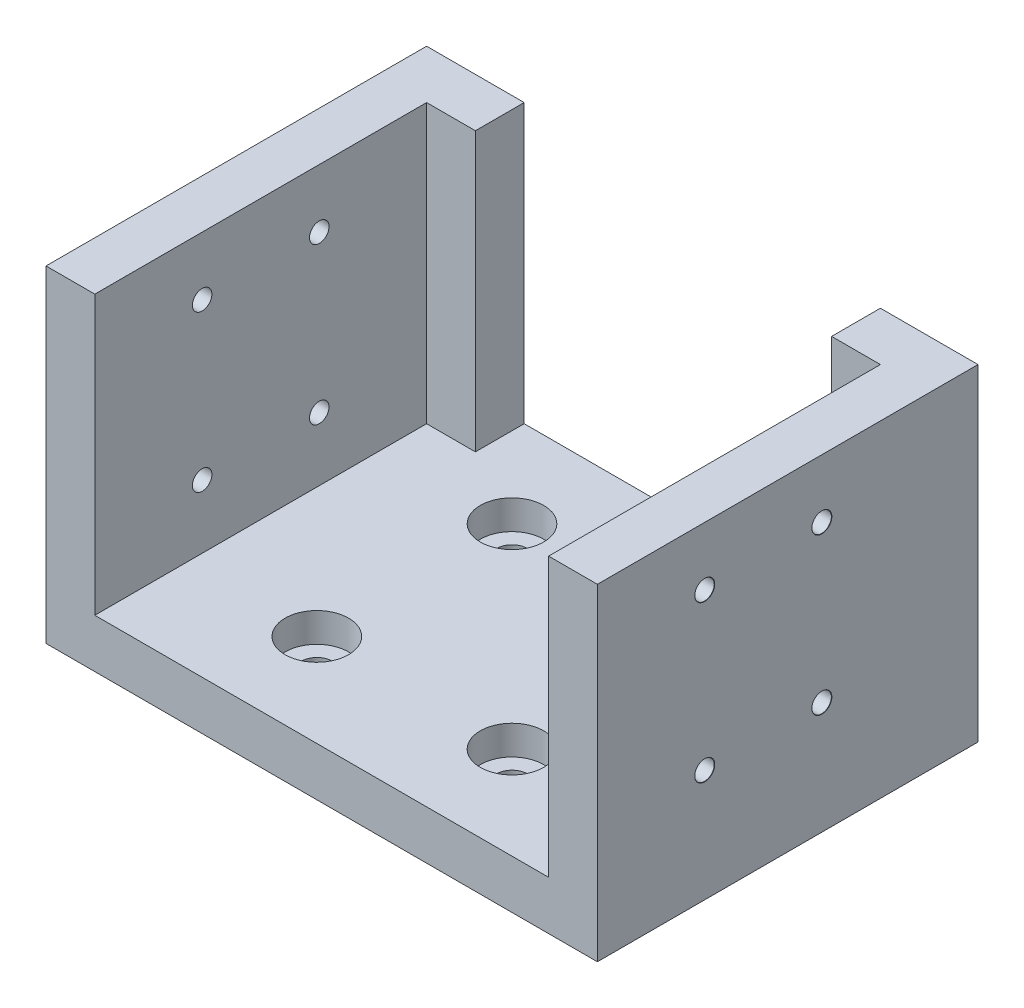
ISO-10303-21;
HEADER;
FILE_DESCRIPTION(('STEP AP214'),'2;1');
FILE_NAME('part.step','',(''),(''),'','','');
FILE_SCHEMA(('AUTOMOTIVE_DESIGN { 1 0 10303 214 1 1 1 1 }'));
ENDSEC;
DATA;
#1=APPLICATION_CONTEXT('core data for automotive mechanical design processes');
#2=APPLICATION_PROTOCOL_DEFINITION('international standard','automotive_design',2000,#1);
#3=PRODUCT_CONTEXT('',#1,'mechanical');
#4=PRODUCT('Part','Part','',(#3));
#5=PRODUCT_RELATED_PRODUCT_CATEGORY('part','',(#4));
#6=PRODUCT_DEFINITION_FORMATION('','',#4);
#7=PRODUCT_DEFINITION_CONTEXT('part definition',#1,'design');
#8=PRODUCT_DEFINITION('design','',#6,#7);
#9=PRODUCT_DEFINITION_SHAPE('','',#8);
#10=(LENGTH_UNIT() NAMED_UNIT(*) SI_UNIT(.MILLI.,.METRE.));
#11=(NAMED_UNIT(*) PLANE_ANGLE_UNIT() SI_UNIT($,.RADIAN.));
#12=(NAMED_UNIT(*) SI_UNIT($,.STERADIAN.) SOLID_ANGLE_UNIT());
#13=UNCERTAINTY_MEASURE_WITH_UNIT(LENGTH_MEASURE(1.E-05),#10,'distance_accuracy_value','');
#14=(GEOMETRIC_REPRESENTATION_CONTEXT(3) GLOBAL_UNCERTAINTY_ASSIGNED_CONTEXT((#13)) GLOBAL_UNIT_ASSIGNED_CONTEXT((#10,
#11,#12)) REPRESENTATION_CONTEXT('',''));
#15=CARTESIAN_POINT('',(0.,0.,0.));
#16=DIRECTION('',(0.,0.,1.));
#17=DIRECTION('',(1.,0.,0.));
#18=AXIS2_PLACEMENT_3D('',#15,#16,#17);
#19=CARTESIAN_POINT('',(0.,33.5,0.));
#20=DIRECTION('',(0.,1.,0.));
#21=DIRECTION('',(0.,0.,1.));
#22=AXIS2_PLACEMENT_3D('',#19,#20,#21);
#23=PLANE('',#22);
#24=DIRECTION('',(0.,0.,1.));
#25=VECTOR('',#24,1.);
#26=CARTESIAN_POINT('',(-18.25,33.5,-19.5));
#27=LINE('',#26,#25);
#28=CARTESIAN_POINT('',(-18.25,33.5,-19.5));
#29=VERTEX_POINT('',#28);
#30=CARTESIAN_POINT('',(-18.25,33.5,-14.5));
#31=VERTEX_POINT('',#30);
#32=EDGE_CURVE('E171',#29,#31,#27,.T.);
#33=ORIENTED_EDGE('',*,*,#32,.F.);
#34=DIRECTION('',(1.,0.,0.));
#35=VECTOR('',#34,1.);
#36=CARTESIAN_POINT('',(-28.25,33.5,-19.5));
#37=LINE('',#36,#35);
#38=CARTESIAN_POINT('',(-28.25,33.5,-19.5));
#39=VERTEX_POINT('',#38);
#40=EDGE_CURVE('E157',#39,#29,#37,.T.);
#41=ORIENTED_EDGE('',*,*,#40,.F.);
#42=DIRECTION('',(0.,0.,-1.));
#43=VECTOR('',#42,1.);
#44=CARTESIAN_POINT('',(-28.25,33.5,19.5));
#45=LINE('',#44,#43);
#46=CARTESIAN_POINT('',(-28.25,33.5,19.5));
#47=VERTEX_POINT('',#46);
#48=EDGE_CURVE('E231',#47,#39,#45,.T.);
#49=ORIENTED_EDGE('',*,*,#48,.F.);
#50=DIRECTION('',(1.,0.,0.));
#51=VECTOR('',#50,1.);
#52=CARTESIAN_POINT('',(-28.25,33.5,19.5));
#53=LINE('',#52,#51);
#54=CARTESIAN_POINT('',(-23.25,33.5,19.5));
#55=VERTEX_POINT('',#54);
#56=EDGE_CURVE('E227',#47,#55,#53,.T.);
#57=ORIENTED_EDGE('',*,*,#56,.T.);
#58=DIRECTION('',(0.,0.,1.));
#59=VECTOR('',#58,1.);
#60=CARTESIAN_POINT('',(-23.25,33.5,14.5));
#61=LINE('',#60,#59);
#62=CARTESIAN_POINT('',(-23.25,33.5,-14.5));
#63=VERTEX_POINT('',#62);
#64=EDGE_CURVE('E185',#63,#55,#61,.T.);
#65=ORIENTED_EDGE('',*,*,#64,.F.);
#66=DIRECTION('',(-1.,0.,0.));
#67=VECTOR('',#66,1.);
#68=CARTESIAN_POINT('',(23.25,33.5,-14.5));
#69=LINE('',#68,#67);
#70=EDGE_CURVE('E199',#31,#63,#69,.T.);
#71=ORIENTED_EDGE('',*,*,#70,.F.);
#72=EDGE_LOOP('',(#33,#41,#49,#57,#65,#71));
#73=FACE_BOUND('',#72,.T.);
#74=ADVANCED_FACE('F45',(#73),#23,.T.);
#75=CARTESIAN_POINT('',(23.25,5.,-14.5));
#76=DIRECTION('',(0.,0.,-1.));
#77=DIRECTION('',(-1.,0.,0.));
#78=AXIS2_PLACEMENT_3D('',#75,#76,#77);
#79=PLANE('',#78);
#80=DIRECTION('',(-1.,0.,0.));
#81=VECTOR('',#80,1.);
#82=CARTESIAN_POINT('',(23.25,5.,-14.5));
#83=LINE('',#82,#81);
#84=CARTESIAN_POINT('',(-18.25,5.,-14.5));
#85=VERTEX_POINT('',#84);
#86=CARTESIAN_POINT('',(-23.25,5.,-14.5));
#87=VERTEX_POINT('',#86);
#88=EDGE_CURVE('E184',#85,#87,#83,.T.);
#89=ORIENTED_EDGE('',*,*,#88,.F.);
#90=DIRECTION('',(0.,-1.,0.));
#91=VECTOR('',#90,1.);
#92=CARTESIAN_POINT('',(-18.25,33.5,-14.5));
#93=LINE('',#92,#91);
#94=EDGE_CURVE('E63',#31,#85,#93,.T.);
#95=ORIENTED_EDGE('',*,*,#94,.F.);
#96=ORIENTED_EDGE('',*,*,#70,.T.);
#97=DIRECTION('',(0.,1.,0.));
#98=VECTOR('',#97,1.);
#99=CARTESIAN_POINT('',(-23.25,5.,-14.5));
#100=LINE('',#99,#98);
#101=EDGE_CURVE('E213',#87,#63,#100,.T.);
#102=ORIENTED_EDGE('',*,*,#101,.F.);
#103=EDGE_LOOP('',(#89,#95,#96,#102));
#104=FACE_BOUND('',#103,.T.);
#105=ADVANCED_FACE('F402',(#104),#79,.F.);
#106=CARTESIAN_POINT('',(-28.25,33.5,-19.5));
#107=DIRECTION('',(0.,0.,-1.));
#108=DIRECTION('',(-1.,0.,0.));
#109=AXIS2_PLACEMENT_3D('',#106,#107,#108);
#110=PLANE('',#109);
#111=DIRECTION('',(0.,-1.,0.));
#112=VECTOR('',#111,1.);
#113=CARTESIAN_POINT('',(-18.25,33.5,-19.5));
#114=LINE('',#113,#112);
#115=CARTESIAN_POINT('',(-18.25,5.,-19.5));
#116=VERTEX_POINT('',#115);
#117=EDGE_CURVE('E138',#29,#116,#114,.T.);
#118=ORIENTED_EDGE('',*,*,#117,.T.);
#119=DIRECTION('',(1.,0.,0.));
#120=VECTOR('',#119,1.);
#121=CARTESIAN_POINT('',(-18.25,5.,-19.5));
#122=LINE('',#121,#120);
#123=CARTESIAN_POINT('',(18.25,5.,-19.5));
#124=VERTEX_POINT('',#123);
#125=EDGE_CURVE('E147',#116,#124,#122,.T.);
#126=ORIENTED_EDGE('',*,*,#125,.T.);
#127=DIRECTION('',(0.,1.,0.));
#128=VECTOR('',#127,1.);
#129=CARTESIAN_POINT('',(18.25,33.5,-19.5));
#130=LINE('',#129,#128);
#131=CARTESIAN_POINT('',(18.25,33.5,-19.5));
#132=VERTEX_POINT('',#131);
#133=EDGE_CURVE('E144',#124,#132,#130,.T.);
#134=ORIENTED_EDGE('',*,*,#133,.T.);
#135=CARTESIAN_POINT('',(28.25,33.5,-19.5));
#136=VERTEX_POINT('',#135);
#137=EDGE_CURVE('E222',#132,#136,#37,.T.);
#138=ORIENTED_EDGE('',*,*,#137,.T.);
#139=DIRECTION('',(0.,-1.,0.));
#140=VECTOR('',#139,1.);
#141=CARTESIAN_POINT('',(28.25,33.5,-19.5));
#142=LINE('',#141,#140);
#143=CARTESIAN_POINT('',(28.25,0.,-19.5));
#144=VERTEX_POINT('',#143);
#145=EDGE_CURVE('E235',#136,#144,#142,.T.);
#146=ORIENTED_EDGE('',*,*,#145,.T.);
#147=DIRECTION('',(1.,0.,0.));
#148=VECTOR('',#147,1.);
#149=CARTESIAN_POINT('',(-28.25,0.,-19.5));
#150=LINE('',#149,#148);
#151=CARTESIAN_POINT('',(-28.25,0.,-19.5));
#152=VERTEX_POINT('',#151);
#153=EDGE_CURVE('E208',#152,#144,#150,.T.);
#154=ORIENTED_EDGE('',*,*,#153,.F.);
#155=DIRECTION('',(0.,-1.,0.));
#156=VECTOR('',#155,1.);
#157=CARTESIAN_POINT('',(-28.25,33.5,-19.5));
#158=LINE('',#157,#156);
#159=EDGE_CURVE('E11',#39,#152,#158,.T.);
#160=ORIENTED_EDGE('',*,*,#159,.F.);
#161=ORIENTED_EDGE('',*,*,#40,.T.);
#162=EDGE_LOOP('',(#118,#126,#134,#138,#146,#154,#160,#161));
#163=FACE_BOUND('',#162,.T.);
#164=ADVANCED_FACE('F47',(#163),#110,.T.);
#165=CARTESIAN_POINT('',(-28.25,33.5,19.5));
#166=DIRECTION('',(-1.,0.,0.));
#167=DIRECTION('',(0.,0.,1.));
#168=AXIS2_PLACEMENT_3D('',#165,#166,#167);
#169=PLANE('',#168);
#170=CARTESIAN_POINT('',(-28.25,11.5,8.49999999999999));
#171=DIRECTION('',(1.,0.,0.));
#172=DIRECTION('',(0.,0.,-1.));
#173=AXIS2_PLACEMENT_3D('',#170,#171,#172);
#174=CIRCLE('',#173,0.999999999999994);
#175=CARTESIAN_POINT('',(-28.25,11.5,7.5));
#176=VERTEX_POINT('',#175);
#177=EDGE_CURVE('E469',#176,#176,#174,.T.);
#178=ORIENTED_EDGE('',*,*,#177,.T.);
#179=EDGE_LOOP('',(#178));
#180=FACE_BOUND('',#179,.T.);
#181=CARTESIAN_POINT('',(-28.25,11.5,-3.50000000000001));
#182=DIRECTION('',(1.,0.,0.));
#183=DIRECTION('',(0.,0.,-1.));
#184=AXIS2_PLACEMENT_3D('',#181,#182,#183);
#185=CIRCLE('',#184,0.999999999999994);
#186=CARTESIAN_POINT('',(-28.25,11.5,-4.5));
#187=VERTEX_POINT('',#186);
#188=EDGE_CURVE('E273',#187,#187,#185,.T.);
#189=ORIENTED_EDGE('',*,*,#188,.T.);
#190=EDGE_LOOP('',(#189));
#191=FACE_BOUND('',#190,.T.);
#192=CARTESIAN_POINT('',(-28.25,27.5,-3.50000000000001));
#193=DIRECTION('',(1.,0.,0.));
#194=DIRECTION('',(0.,0.,-1.));
#195=AXIS2_PLACEMENT_3D('',#192,#193,#194);
#196=CIRCLE('',#195,0.999999999999994);
#197=CARTESIAN_POINT('',(-28.25,27.5,-4.5));
#198=VERTEX_POINT('',#197);
#199=EDGE_CURVE('E268',#198,#198,#196,.T.);
#200=ORIENTED_EDGE('',*,*,#199,.T.);
#201=EDGE_LOOP('',(#200));
#202=FACE_BOUND('',#201,.T.);
#203=CARTESIAN_POINT('',(-28.25,27.5,8.49999999999999));
#204=DIRECTION('',(1.,0.,0.));
#205=DIRECTION('',(0.,0.,-1.));
#206=AXIS2_PLACEMENT_3D('',#203,#204,#205);
#207=CIRCLE('',#206,0.999999999999994);
#208=CARTESIAN_POINT('',(-28.25,27.5,7.5));
#209=VERTEX_POINT('',#208);
#210=EDGE_CURVE('E263',#209,#209,#207,.T.);
#211=ORIENTED_EDGE('',*,*,#210,.T.);
#212=EDGE_LOOP('',(#211));
#213=FACE_BOUND('',#212,.T.);
#214=DIRECTION('',(0.,0.,-1.));
#215=VECTOR('',#214,1.);
#216=CARTESIAN_POINT('',(-28.25,0.,19.5));
#217=LINE('',#216,#215);
#218=CARTESIAN_POINT('',(-28.25,0.,19.5));
#219=VERTEX_POINT('',#218);
#220=EDGE_CURVE('E246',#219,#152,#217,.T.);
#221=ORIENTED_EDGE('',*,*,#220,.F.);
#222=DIRECTION('',(0.,-1.,0.));
#223=VECTOR('',#222,1.);
#224=CARTESIAN_POINT('',(-28.25,33.5,19.5));
#225=LINE('',#224,#223);
#226=EDGE_CURVE('E55',#47,#219,#225,.T.);
#227=ORIENTED_EDGE('',*,*,#226,.F.);
#228=ORIENTED_EDGE('',*,*,#48,.T.);
#229=ORIENTED_EDGE('',*,*,#159,.T.);
#230=EDGE_LOOP('',(#221,#227,#228,#229));
#231=FACE_BOUND('',#230,.T.);
#232=ADVANCED_FACE('F456',(#180,#191,#202,#213,#231),#169,.T.);
#233=CARTESIAN_POINT('',(-28.25,33.5,19.5));
#234=DIRECTION('',(0.,0.,-1.));
#235=DIRECTION('',(-1.,0.,0.));
#236=AXIS2_PLACEMENT_3D('',#233,#234,#235);
#237=PLANE('',#236);
#238=DIRECTION('',(1.,0.,0.));
#239=VECTOR('',#238,1.);
#240=CARTESIAN_POINT('',(-23.25,5.,19.5));
#241=LINE('',#240,#239);
#242=CARTESIAN_POINT('',(-23.25,5.,19.5));
#243=VERTEX_POINT('',#242);
#244=CARTESIAN_POINT('',(23.25,5.,19.5));
#245=VERTEX_POINT('',#244);
#246=EDGE_CURVE('E192',#243,#245,#241,.T.);
#247=ORIENTED_EDGE('',*,*,#246,.F.);
#248=DIRECTION('',(0.,1.,0.));
#249=VECTOR('',#248,1.);
#250=CARTESIAN_POINT('',(-23.25,5.,19.5));
#251=LINE('',#250,#249);
#252=EDGE_CURVE('E209',#243,#55,#251,.T.);
#253=ORIENTED_EDGE('',*,*,#252,.T.);
#254=ORIENTED_EDGE('',*,*,#56,.F.);
#255=ORIENTED_EDGE('',*,*,#226,.T.);
#256=DIRECTION('',(1.,0.,0.));
#257=VECTOR('',#256,1.);
#258=CARTESIAN_POINT('',(-28.25,0.,19.5));
#259=LINE('',#258,#257);
#260=CARTESIAN_POINT('',(28.25,0.,19.5));
#261=VERTEX_POINT('',#260);
#262=EDGE_CURVE('E243',#219,#261,#259,.T.);
#263=ORIENTED_EDGE('',*,*,#262,.T.);
#264=DIRECTION('',(0.,-1.,0.));
#265=VECTOR('',#264,1.);
#266=CARTESIAN_POINT('',(28.25,33.5,19.5));
#267=LINE('',#266,#265);
#268=CARTESIAN_POINT('',(28.25,33.5,19.5));
#269=VERTEX_POINT('',#268);
#270=EDGE_CURVE('E252',#269,#261,#267,.T.);
#271=ORIENTED_EDGE('',*,*,#270,.F.);
#272=CARTESIAN_POINT('',(23.25,33.5,19.5));
#273=VERTEX_POINT('',#272);
#274=EDGE_CURVE('E226',#273,#269,#53,.T.);
#275=ORIENTED_EDGE('',*,*,#274,.F.);
#276=DIRECTION('',(0.,1.,0.));
#277=VECTOR('',#276,1.);
#278=CARTESIAN_POINT('',(23.25,5.,19.5));
#279=LINE('',#278,#277);
#280=EDGE_CURVE('E71',#245,#273,#279,.T.);
#281=ORIENTED_EDGE('',*,*,#280,.F.);
#282=EDGE_LOOP('',(#247,#253,#254,#255,#263,#271,#275,#281));
#283=FACE_BOUND('',#282,.T.);
#284=ADVANCED_FACE('F426',(#283),#237,.F.);
#285=CARTESIAN_POINT('',(28.25,33.5,19.5));
#286=DIRECTION('',(-1.,0.,0.));
#287=DIRECTION('',(0.,0.,1.));
#288=AXIS2_PLACEMENT_3D('',#285,#286,#287);
#289=PLANE('',#288);
#290=CARTESIAN_POINT('',(28.25,11.5,8.49999999999999));
#291=DIRECTION('',(1.,0.,0.));
#292=DIRECTION('',(0.,0.,-1.));
#293=AXIS2_PLACEMENT_3D('',#290,#291,#292);
#294=CIRCLE('',#293,1.025);
#295=CARTESIAN_POINT('',(28.25,11.5,7.47499999999999));
#296=VERTEX_POINT('',#295);
#297=EDGE_CURVE('E718',#296,#296,#294,.T.);
#298=ORIENTED_EDGE('',*,*,#297,.F.);
#299=EDGE_LOOP('',(#298));
#300=FACE_BOUND('',#299,.T.);
#301=CARTESIAN_POINT('',(28.25,11.5,-3.50000000000001));
#302=DIRECTION('',(1.,0.,0.));
#303=DIRECTION('',(0.,0.,-1.));
#304=AXIS2_PLACEMENT_3D('',#301,#302,#303);
#305=CIRCLE('',#304,1.025);
#306=CARTESIAN_POINT('',(28.25,11.5,-4.52500000000001));
#307=VERTEX_POINT('',#306);
#308=EDGE_CURVE('E288',#307,#307,#305,.T.);
#309=ORIENTED_EDGE('',*,*,#308,.F.);
#310=EDGE_LOOP('',(#309));
#311=FACE_BOUND('',#310,.T.);
#312=CARTESIAN_POINT('',(28.25,27.5,-3.50000000000001));
#313=DIRECTION('',(1.,0.,0.));
#314=DIRECTION('',(0.,0.,-1.));
#315=AXIS2_PLACEMENT_3D('',#312,#313,#314);
#316=CIRCLE('',#315,1.025);
#317=CARTESIAN_POINT('',(28.25,27.5,-4.52500000000001));
#318=VERTEX_POINT('',#317);
#319=EDGE_CURVE('E279',#318,#318,#316,.T.);
#320=ORIENTED_EDGE('',*,*,#319,.F.);
#321=EDGE_LOOP('',(#320));
#322=FACE_BOUND('',#321,.T.);
#323=CARTESIAN_POINT('',(28.25,27.5,8.49999999999999));
#324=DIRECTION('',(1.,0.,0.));
#325=DIRECTION('',(0.,0.,-1.));
#326=AXIS2_PLACEMENT_3D('',#323,#324,#325);
#327=CIRCLE('',#326,1.025);
#328=CARTESIAN_POINT('',(28.25,27.5,7.47499999999999));
#329=VERTEX_POINT('',#328);
#330=EDGE_CURVE('E305',#329,#329,#327,.T.);
#331=ORIENTED_EDGE('',*,*,#330,.F.);
#332=EDGE_LOOP('',(#331));
#333=FACE_BOUND('',#332,.T.);
#334=DIRECTION('',(0.,0.,-1.));
#335=VECTOR('',#334,1.);
#336=CARTESIAN_POINT('',(28.25,0.,19.5));
#337=LINE('',#336,#335);
#338=EDGE_CURVE('E239',#261,#144,#337,.T.);
#339=ORIENTED_EDGE('',*,*,#338,.T.);
#340=ORIENTED_EDGE('',*,*,#145,.F.);
#341=DIRECTION('',(0.,0.,-1.));
#342=VECTOR('',#341,1.);
#343=CARTESIAN_POINT('',(28.25,33.5,19.5));
#344=LINE('',#343,#342);
#345=EDGE_CURVE('E221',#269,#136,#344,.T.);
#346=ORIENTED_EDGE('',*,*,#345,.F.);
#347=ORIENTED_EDGE('',*,*,#270,.T.);
#348=EDGE_LOOP('',(#339,#340,#346,#347));
#349=FACE_BOUND('',#348,.T.);
#350=ADVANCED_FACE('F416',(#300,#311,#322,#333,#349),#289,.F.);
#351=DIRECTION('',(0.,0.,1.));
#352=VECTOR('',#351,1.);
#353=CARTESIAN_POINT('',(18.25,33.5,-19.5));
#354=LINE('',#353,#352);
#355=CARTESIAN_POINT('',(18.25,33.5,-14.5));
#356=VERTEX_POINT('',#355);
#357=EDGE_CURVE('E175',#132,#356,#354,.T.);
#358=ORIENTED_EDGE('',*,*,#357,.T.);
#359=CARTESIAN_POINT('',(23.25,33.5,-14.5));
#360=VERTEX_POINT('',#359);
#361=EDGE_CURVE('E200',#360,#356,#69,.T.);
#362=ORIENTED_EDGE('',*,*,#361,.F.);
#363=DIRECTION('',(0.,0.,-1.));
#364=VECTOR('',#363,1.);
#365=CARTESIAN_POINT('',(23.25,33.5,14.5));
#366=LINE('',#365,#364);
#367=EDGE_CURVE('E174',#273,#360,#366,.T.);
#368=ORIENTED_EDGE('',*,*,#367,.F.);
#369=ORIENTED_EDGE('',*,*,#274,.T.);
#370=ORIENTED_EDGE('',*,*,#345,.T.);
#371=ORIENTED_EDGE('',*,*,#137,.F.);
#372=EDGE_LOOP('',(#358,#362,#368,#369,#370,#371));
#373=FACE_BOUND('',#372,.T.);
#374=ADVANCED_FACE('F405',(#373),#23,.T.);
#375=CARTESIAN_POINT('',(0.,0.,0.));
#376=DIRECTION('',(0.,1.,0.));
#377=DIRECTION('',(0.,0.,1.));
#378=AXIS2_PLACEMENT_3D('',#375,#376,#377);
#379=PLANE('',#378);
#380=CARTESIAN_POINT('',(10.,0.,-10.));
#381=DIRECTION('',(0.,1.,0.));
#382=DIRECTION('',(0.,0.,1.));
#383=AXIS2_PLACEMENT_3D('',#380,#381,#382);
#384=CIRCLE('',#383,1.6);
#385=CARTESIAN_POINT('',(10.,0.,-8.4));
#386=VERTEX_POINT('',#385);
#387=EDGE_CURVE('E331',#386,#386,#384,.T.);
#388=ORIENTED_EDGE('',*,*,#387,.T.);
#389=EDGE_LOOP('',(#388));
#390=FACE_BOUND('',#389,.T.);
#391=CARTESIAN_POINT('',(10.,0.,10.));
#392=DIRECTION('',(0.,1.,0.));
#393=DIRECTION('',(0.,0.,1.));
#394=AXIS2_PLACEMENT_3D('',#391,#392,#393);
#395=CIRCLE('',#394,1.6);
#396=CARTESIAN_POINT('',(10.,0.,11.6));
#397=VERTEX_POINT('',#396);
#398=EDGE_CURVE('E347',#397,#397,#395,.T.);
#399=ORIENTED_EDGE('',*,*,#398,.T.);
#400=EDGE_LOOP('',(#399));
#401=FACE_BOUND('',#400,.T.);
#402=CARTESIAN_POINT('',(-10.,0.,10.));
#403=DIRECTION('',(0.,1.,0.));
#404=DIRECTION('',(0.,0.,1.));
#405=AXIS2_PLACEMENT_3D('',#402,#403,#404);
#406=CIRCLE('',#405,1.6);
#407=CARTESIAN_POINT('',(-10.,0.,11.6));
#408=VERTEX_POINT('',#407);
#409=EDGE_CURVE('E363',#408,#408,#406,.T.);
#410=ORIENTED_EDGE('',*,*,#409,.T.);
#411=EDGE_LOOP('',(#410));
#412=FACE_BOUND('',#411,.T.);
#413=CARTESIAN_POINT('',(-10.,0.,-10.));
#414=DIRECTION('',(0.,1.,0.));
#415=DIRECTION('',(0.,0.,1.));
#416=AXIS2_PLACEMENT_3D('',#413,#414,#415);
#417=CIRCLE('',#416,1.6);
#418=CARTESIAN_POINT('',(-10.,0.,-8.4));
#419=VERTEX_POINT('',#418);
#420=EDGE_CURVE('E164',#419,#419,#417,.T.);
#421=ORIENTED_EDGE('',*,*,#420,.T.);
#422=EDGE_LOOP('',(#421));
#423=FACE_BOUND('',#422,.T.);
#424=ORIENTED_EDGE('',*,*,#153,.T.);
#425=ORIENTED_EDGE('',*,*,#338,.F.);
#426=ORIENTED_EDGE('',*,*,#262,.F.);
#427=ORIENTED_EDGE('',*,*,#220,.T.);
#428=EDGE_LOOP('',(#424,#425,#426,#427));
#429=FACE_BOUND('',#428,.T.);
#430=ADVANCED_FACE('F383',(#390,#401,#412,#423,#429),#379,.F.);
#431=CARTESIAN_POINT('',(-23.25,5.,14.5));
#432=DIRECTION('',(-1.,0.,0.));
#433=DIRECTION('',(0.,0.,1.));
#434=AXIS2_PLACEMENT_3D('',#431,#432,#433);
#435=PLANE('',#434);
#436=CARTESIAN_POINT('',(-23.25,11.5,8.49999999999999));
#437=DIRECTION('',(-1.,0.,0.));
#438=DIRECTION('',(0.,0.,1.));
#439=AXIS2_PLACEMENT_3D('',#436,#437,#438);
#440=CIRCLE('',#439,0.999999999999997);
#441=CARTESIAN_POINT('',(-23.25,11.5,9.49999999999999));
#442=VERTEX_POINT('',#441);
#443=EDGE_CURVE('E49',#442,#442,#440,.T.);
#444=ORIENTED_EDGE('',*,*,#443,.T.);
#445=EDGE_LOOP('',(#444));
#446=FACE_BOUND('',#445,.T.);
#447=CARTESIAN_POINT('',(-23.25,11.5,-3.50000000000001));
#448=DIRECTION('',(-1.,0.,0.));
#449=DIRECTION('',(0.,0.,1.));
#450=AXIS2_PLACEMENT_3D('',#447,#448,#449);
#451=CIRCLE('',#450,0.999999999999997);
#452=CARTESIAN_POINT('',(-23.25,11.5,-2.50000000000001));
#453=VERTEX_POINT('',#452);
#454=EDGE_CURVE('E269',#453,#453,#451,.T.);
#455=ORIENTED_EDGE('',*,*,#454,.T.);
#456=EDGE_LOOP('',(#455));
#457=FACE_BOUND('',#456,.T.);
#458=CARTESIAN_POINT('',(-23.25,27.5,-3.50000000000001));
#459=DIRECTION('',(-1.,0.,0.));
#460=DIRECTION('',(0.,0.,1.));
#461=AXIS2_PLACEMENT_3D('',#458,#459,#460);
#462=CIRCLE('',#461,0.999999999999997);
#463=CARTESIAN_POINT('',(-23.25,27.5,-2.50000000000001));
#464=VERTEX_POINT('',#463);
#465=EDGE_CURVE('E267',#464,#464,#462,.T.);
#466=ORIENTED_EDGE('',*,*,#465,.T.);
#467=EDGE_LOOP('',(#466));
#468=FACE_BOUND('',#467,.T.);
#469=CARTESIAN_POINT('',(-23.25,27.5,8.49999999999999));
#470=DIRECTION('',(-1.,0.,0.));
#471=DIRECTION('',(0.,0.,1.));
#472=AXIS2_PLACEMENT_3D('',#469,#470,#471);
#473=CIRCLE('',#472,0.999999999999997);
#474=CARTESIAN_POINT('',(-23.25,27.5,9.49999999999999));
#475=VERTEX_POINT('',#474);
#476=EDGE_CURVE('E258',#475,#475,#473,.T.);
#477=ORIENTED_EDGE('',*,*,#476,.T.);
#478=EDGE_LOOP('',(#477));
#479=FACE_BOUND('',#478,.T.);
#480=ORIENTED_EDGE('',*,*,#64,.T.);
#481=ORIENTED_EDGE('',*,*,#252,.F.);
#482=DIRECTION('',(0.,0.,1.));
#483=VECTOR('',#482,1.);
#484=CARTESIAN_POINT('',(-23.25,5.,-14.5));
#485=LINE('',#484,#483);
#486=EDGE_CURVE('E189',#87,#243,#485,.T.);
#487=ORIENTED_EDGE('',*,*,#486,.F.);
#488=ORIENTED_EDGE('',*,*,#101,.T.);
#489=EDGE_LOOP('',(#480,#481,#487,#488));
#490=FACE_BOUND('',#489,.T.);
#491=ADVANCED_FACE('F423',(#446,#457,#468,#479,#490),#435,.F.);
#492=ORIENTED_EDGE('',*,*,#361,.T.);
#493=DIRECTION('',(0.,1.,0.));
#494=VECTOR('',#493,1.);
#495=CARTESIAN_POINT('',(18.25,33.5,-14.5));
#496=LINE('',#495,#494);
#497=CARTESIAN_POINT('',(18.25,5.,-14.5));
#498=VERTEX_POINT('',#497);
#499=EDGE_CURVE('E159',#498,#356,#496,.T.);
#500=ORIENTED_EDGE('',*,*,#499,.F.);
#501=CARTESIAN_POINT('',(23.25,5.,-14.5));
#502=VERTEX_POINT('',#501);
#503=EDGE_CURVE('E186',#502,#498,#83,.T.);
#504=ORIENTED_EDGE('',*,*,#503,.F.);
#505=DIRECTION('',(0.,1.,0.));
#506=VECTOR('',#505,1.);
#507=CARTESIAN_POINT('',(23.25,5.,-14.5));
#508=LINE('',#507,#506);
#509=EDGE_CURVE('E196',#502,#360,#508,.T.);
#510=ORIENTED_EDGE('',*,*,#509,.T.);
#511=EDGE_LOOP('',(#492,#500,#504,#510));
#512=FACE_BOUND('',#511,.T.);
#513=ADVANCED_FACE('F412',(#512),#79,.F.);
#514=CARTESIAN_POINT('',(23.25,5.,14.5));
#515=DIRECTION('',(1.,0.,0.));
#516=DIRECTION('',(0.,0.,-1.));
#517=AXIS2_PLACEMENT_3D('',#514,#515,#516);
#518=PLANE('',#517);
#519=CARTESIAN_POINT('',(23.25,11.5,8.49999999999999));
#520=DIRECTION('',(1.,0.,0.));
#521=DIRECTION('',(0.,0.,-1.));
#522=AXIS2_PLACEMENT_3D('',#519,#520,#521);
#523=CIRCLE('',#522,0.999999999999997);
#524=CARTESIAN_POINT('',(23.25,11.5,7.49999999999999));
#525=VERTEX_POINT('',#524);
#526=EDGE_CURVE('E499',#525,#525,#523,.T.);
#527=ORIENTED_EDGE('',*,*,#526,.T.);
#528=EDGE_LOOP('',(#527));
#529=FACE_BOUND('',#528,.T.);
#530=CARTESIAN_POINT('',(23.25,11.5,-3.50000000000001));
#531=DIRECTION('',(1.,0.,0.));
#532=DIRECTION('',(0.,0.,-1.));
#533=AXIS2_PLACEMENT_3D('',#530,#531,#532);
#534=CIRCLE('',#533,0.999999999999997);
#535=CARTESIAN_POINT('',(23.25,11.5,-4.50000000000001));
#536=VERTEX_POINT('',#535);
#537=EDGE_CURVE('E272',#536,#536,#534,.T.);
#538=ORIENTED_EDGE('',*,*,#537,.T.);
#539=EDGE_LOOP('',(#538));
#540=FACE_BOUND('',#539,.T.);
#541=CARTESIAN_POINT('',(23.25,27.5,-3.50000000000001));
#542=DIRECTION('',(1.,0.,0.));
#543=DIRECTION('',(0.,0.,-1.));
#544=AXIS2_PLACEMENT_3D('',#541,#542,#543);
#545=CIRCLE('',#544,0.999999999999997);
#546=CARTESIAN_POINT('',(23.25,27.5,-4.50000000000001));
#547=VERTEX_POINT('',#546);
#548=EDGE_CURVE('E264',#547,#547,#545,.T.);
#549=ORIENTED_EDGE('',*,*,#548,.T.);
#550=EDGE_LOOP('',(#549));
#551=FACE_BOUND('',#550,.T.);
#552=CARTESIAN_POINT('',(23.25,27.5,8.49999999999999));
#553=DIRECTION('',(1.,0.,0.));
#554=DIRECTION('',(0.,0.,-1.));
#555=AXIS2_PLACEMENT_3D('',#552,#553,#554);
#556=CIRCLE('',#555,0.999999999999997);
#557=CARTESIAN_POINT('',(23.25,27.5,7.49999999999999));
#558=VERTEX_POINT('',#557);
#559=EDGE_CURVE('E262',#558,#558,#556,.T.);
#560=ORIENTED_EDGE('',*,*,#559,.T.);
#561=EDGE_LOOP('',(#560));
#562=FACE_BOUND('',#561,.T.);
#563=ORIENTED_EDGE('',*,*,#367,.T.);
#564=ORIENTED_EDGE('',*,*,#509,.F.);
#565=DIRECTION('',(0.,0.,-1.));
#566=VECTOR('',#565,1.);
#567=CARTESIAN_POINT('',(23.25,5.,14.5));
#568=LINE('',#567,#566);
#569=EDGE_CURVE('E181',#245,#502,#568,.T.);
#570=ORIENTED_EDGE('',*,*,#569,.F.);
#571=ORIENTED_EDGE('',*,*,#280,.T.);
#572=EDGE_LOOP('',(#563,#564,#570,#571));
#573=FACE_BOUND('',#572,.T.);
#574=ADVANCED_FACE('F434',(#529,#540,#551,#562,#573),#518,.F.);
#575=CARTESIAN_POINT('',(0.,5.,0.));
#576=DIRECTION('',(0.,1.,0.));
#577=DIRECTION('',(0.,0.,1.));
#578=AXIS2_PLACEMENT_3D('',#575,#576,#577);
#579=PLANE('',#578);
#580=CARTESIAN_POINT('',(10.,5.,-10.));
#581=DIRECTION('',(0.,1.,0.));
#582=DIRECTION('',(0.,0.,1.));
#583=AXIS2_PLACEMENT_3D('',#580,#581,#582);
#584=CIRCLE('',#583,3.25);
#585=CARTESIAN_POINT('',(10.,5.,-6.75));
#586=VERTEX_POINT('',#585);
#587=EDGE_CURVE('E319',#586,#586,#584,.T.);
#588=ORIENTED_EDGE('',*,*,#587,.F.);
#589=EDGE_LOOP('',(#588));
#590=FACE_BOUND('',#589,.T.);
#591=CARTESIAN_POINT('',(10.,5.,10.));
#592=DIRECTION('',(0.,1.,0.));
#593=DIRECTION('',(0.,0.,1.));
#594=AXIS2_PLACEMENT_3D('',#591,#592,#593);
#595=CIRCLE('',#594,3.25);
#596=CARTESIAN_POINT('',(10.,5.,13.25));
#597=VERTEX_POINT('',#596);
#598=EDGE_CURVE('E335',#597,#597,#595,.T.);
#599=ORIENTED_EDGE('',*,*,#598,.F.);
#600=EDGE_LOOP('',(#599));
#601=FACE_BOUND('',#600,.T.);
#602=CARTESIAN_POINT('',(-10.,5.,10.));
#603=DIRECTION('',(0.,1.,0.));
#604=DIRECTION('',(0.,0.,1.));
#605=AXIS2_PLACEMENT_3D('',#602,#603,#604);
#606=CIRCLE('',#605,3.25);
#607=CARTESIAN_POINT('',(-10.,5.,13.25));
#608=VERTEX_POINT('',#607);
#609=EDGE_CURVE('E351',#608,#608,#606,.T.);
#610=ORIENTED_EDGE('',*,*,#609,.F.);
#611=EDGE_LOOP('',(#610));
#612=FACE_BOUND('',#611,.T.);
#613=CARTESIAN_POINT('',(-10.,5.,-10.));
#614=DIRECTION('',(0.,1.,0.));
#615=DIRECTION('',(0.,0.,1.));
#616=AXIS2_PLACEMENT_3D('',#613,#614,#615);
#617=CIRCLE('',#616,3.25);
#618=CARTESIAN_POINT('',(-10.,5.,-6.75));
#619=VERTEX_POINT('',#618);
#620=EDGE_CURVE('E367',#619,#619,#617,.T.);
#621=ORIENTED_EDGE('',*,*,#620,.F.);
#622=EDGE_LOOP('',(#621));
#623=FACE_BOUND('',#622,.T.);
#624=ORIENTED_EDGE('',*,*,#569,.T.);
#625=ORIENTED_EDGE('',*,*,#503,.T.);
#626=DIRECTION('',(0.,0.,1.));
#627=VECTOR('',#626,1.);
#628=CARTESIAN_POINT('',(18.25,5.,-19.5));
#629=LINE('',#628,#627);
#630=EDGE_CURVE('E143',#124,#498,#629,.T.);
#631=ORIENTED_EDGE('',*,*,#630,.F.);
#632=ORIENTED_EDGE('',*,*,#125,.F.);
#633=DIRECTION('',(0.,0.,1.));
#634=VECTOR('',#633,1.);
#635=CARTESIAN_POINT('',(-18.25,5.,-19.5));
#636=LINE('',#635,#634);
#637=EDGE_CURVE('E134',#116,#85,#636,.T.);
#638=ORIENTED_EDGE('',*,*,#637,.T.);
#639=ORIENTED_EDGE('',*,*,#88,.T.);
#640=ORIENTED_EDGE('',*,*,#486,.T.);
#641=ORIENTED_EDGE('',*,*,#246,.T.);
#642=EDGE_LOOP('',(#624,#625,#631,#632,#638,#639,#640,#641));
#643=FACE_BOUND('',#642,.T.);
#644=ADVANCED_FACE('F148',(#590,#601,#612,#623,#643),#579,.T.);
#645=CARTESIAN_POINT('',(-18.25,33.5,-19.5));
#646=DIRECTION('',(-1.,0.,0.));
#647=DIRECTION('',(0.,-1.,0.));
#648=AXIS2_PLACEMENT_3D('',#645,#646,#647);
#649=PLANE('',#648);
#650=ORIENTED_EDGE('',*,*,#94,.T.);
#651=ORIENTED_EDGE('',*,*,#637,.F.);
#652=ORIENTED_EDGE('',*,*,#117,.F.);
#653=ORIENTED_EDGE('',*,*,#32,.T.);
#654=EDGE_LOOP('',(#650,#651,#652,#653));
#655=FACE_BOUND('',#654,.T.);
#656=ADVANCED_FACE('F136',(#655),#649,.F.);
#657=CARTESIAN_POINT('',(18.25,33.5,-19.5));
#658=DIRECTION('',(1.,0.,0.));
#659=DIRECTION('',(0.,1.,0.));
#660=AXIS2_PLACEMENT_3D('',#657,#658,#659);
#661=PLANE('',#660);
#662=ORIENTED_EDGE('',*,*,#499,.T.);
#663=ORIENTED_EDGE('',*,*,#357,.F.);
#664=ORIENTED_EDGE('',*,*,#133,.F.);
#665=ORIENTED_EDGE('',*,*,#630,.T.);
#666=EDGE_LOOP('',(#662,#663,#664,#665));
#667=FACE_BOUND('',#666,.T.);
#668=ADVANCED_FACE('F389',(#667),#661,.F.);
#669=CARTESIAN_POINT('',(-10.,5.,-10.));
#670=DIRECTION('',(0.,1.,0.));
#671=DIRECTION('',(0.,0.,1.));
#672=AXIS2_PLACEMENT_3D('',#669,#670,#671);
#673=CYLINDRICAL_SURFACE('',#672,1.60000000000001);
#674=ORIENTED_EDGE('',*,*,#420,.F.);
#675=EDGE_LOOP('',(#674));
#676=FACE_BOUND('',#675,.T.);
#677=CARTESIAN_POINT('',(-10.,2.,-10.));
#678=DIRECTION('',(0.,1.,0.));
#679=DIRECTION('',(0.,0.,1.));
#680=AXIS2_PLACEMENT_3D('',#677,#678,#679);
#681=CIRCLE('',#680,1.60000000000001);
#682=CARTESIAN_POINT('',(-10.,2.,-8.39999999999999));
#683=VERTEX_POINT('',#682);
#684=EDGE_CURVE('E374',#683,#683,#681,.T.);
#685=ORIENTED_EDGE('',*,*,#684,.T.);
#686=EDGE_LOOP('',(#685));
#687=FACE_BOUND('',#686,.T.);
#688=ADVANCED_FACE('F386',(#676,#687),#673,.F.);
#689=CARTESIAN_POINT('',(-8.39999999999999,2.,-10.));
#690=DIRECTION('',(0.,-1.,0.));
#691=DIRECTION('',(0.,0.,-1.));
#692=AXIS2_PLACEMENT_3D('',#689,#690,#691);
#693=PLANE('',#692);
#694=ORIENTED_EDGE('',*,*,#684,.F.);
#695=EDGE_LOOP('',(#694));
#696=FACE_BOUND('',#695,.T.);
#697=CARTESIAN_POINT('',(-10.,2.,-10.));
#698=DIRECTION('',(0.,1.,0.));
#699=DIRECTION('',(0.,0.,1.));
#700=AXIS2_PLACEMENT_3D('',#697,#698,#699);
#701=CIRCLE('',#700,3.25);
#702=CARTESIAN_POINT('',(-10.,2.,-6.75));
#703=VERTEX_POINT('',#702);
#704=EDGE_CURVE('E371',#703,#703,#701,.T.);
#705=ORIENTED_EDGE('',*,*,#704,.T.);
#706=EDGE_LOOP('',(#705));
#707=FACE_BOUND('',#706,.T.);
#708=ADVANCED_FACE('F388',(#696,#707),#693,.F.);
#709=CARTESIAN_POINT('',(-10.,5.,-10.));
#710=DIRECTION('',(0.,1.,0.));
#711=DIRECTION('',(0.,0.,1.));
#712=AXIS2_PLACEMENT_3D('',#709,#710,#711);
#713=CYLINDRICAL_SURFACE('',#712,3.25);
#714=ORIENTED_EDGE('',*,*,#704,.F.);
#715=EDGE_LOOP('',(#714));
#716=FACE_BOUND('',#715,.T.);
#717=ORIENTED_EDGE('',*,*,#620,.T.);
#718=EDGE_LOOP('',(#717));
#719=FACE_BOUND('',#718,.T.);
#720=ADVANCED_FACE('F395',(#716,#719),#713,.F.);
#721=CARTESIAN_POINT('',(-10.,5.,10.));
#722=DIRECTION('',(0.,1.,0.));
#723=DIRECTION('',(0.,0.,1.));
#724=AXIS2_PLACEMENT_3D('',#721,#722,#723);
#725=CYLINDRICAL_SURFACE('',#724,1.60000000000001);
#726=ORIENTED_EDGE('',*,*,#409,.F.);
#727=EDGE_LOOP('',(#726));
#728=FACE_BOUND('',#727,.T.);
#729=CARTESIAN_POINT('',(-10.,2.,10.));
#730=DIRECTION('',(0.,1.,0.));
#731=DIRECTION('',(0.,0.,1.));
#732=AXIS2_PLACEMENT_3D('',#729,#730,#731);
#733=CIRCLE('',#732,1.60000000000001);
#734=CARTESIAN_POINT('',(-10.,2.,11.6));
#735=VERTEX_POINT('',#734);
#736=EDGE_CURVE('E359',#735,#735,#733,.T.);
#737=ORIENTED_EDGE('',*,*,#736,.T.);
#738=EDGE_LOOP('',(#737));
#739=FACE_BOUND('',#738,.T.);
#740=ADVANCED_FACE('F546',(#728,#739),#725,.F.);
#741=CARTESIAN_POINT('',(-8.39999999999999,2.,10.));
#742=DIRECTION('',(0.,-1.,0.));
#743=DIRECTION('',(0.,0.,-1.));
#744=AXIS2_PLACEMENT_3D('',#741,#742,#743);
#745=PLANE('',#744);
#746=ORIENTED_EDGE('',*,*,#736,.F.);
#747=EDGE_LOOP('',(#746));
#748=FACE_BOUND('',#747,.T.);
#749=CARTESIAN_POINT('',(-10.,2.,10.));
#750=DIRECTION('',(0.,1.,0.));
#751=DIRECTION('',(0.,0.,1.));
#752=AXIS2_PLACEMENT_3D('',#749,#750,#751);
#753=CIRCLE('',#752,3.25);
#754=CARTESIAN_POINT('',(-10.,2.,13.25));
#755=VERTEX_POINT('',#754);
#756=EDGE_CURVE('E355',#755,#755,#753,.T.);
#757=ORIENTED_EDGE('',*,*,#756,.T.);
#758=EDGE_LOOP('',(#757));
#759=FACE_BOUND('',#758,.T.);
#760=ADVANCED_FACE('F542',(#748,#759),#745,.F.);
#761=CARTESIAN_POINT('',(-10.,5.,10.));
#762=DIRECTION('',(0.,1.,0.));
#763=DIRECTION('',(0.,0.,1.));
#764=AXIS2_PLACEMENT_3D('',#761,#762,#763);
#765=CYLINDRICAL_SURFACE('',#764,3.25);
#766=ORIENTED_EDGE('',*,*,#756,.F.);
#767=EDGE_LOOP('',(#766));
#768=FACE_BOUND('',#767,.T.);
#769=ORIENTED_EDGE('',*,*,#609,.T.);
#770=EDGE_LOOP('',(#769));
#771=FACE_BOUND('',#770,.T.);
#772=ADVANCED_FACE('F538',(#768,#771),#765,.F.);
#773=CARTESIAN_POINT('',(10.,5.,10.));
#774=DIRECTION('',(0.,1.,0.));
#775=DIRECTION('',(0.,0.,1.));
#776=AXIS2_PLACEMENT_3D('',#773,#774,#775);
#777=CYLINDRICAL_SURFACE('',#776,1.60000000000001);
#778=ORIENTED_EDGE('',*,*,#398,.F.);
#779=EDGE_LOOP('',(#778));
#780=FACE_BOUND('',#779,.T.);
#781=CARTESIAN_POINT('',(10.,2.,10.));
#782=DIRECTION('',(0.,1.,0.));
#783=DIRECTION('',(0.,0.,1.));
#784=AXIS2_PLACEMENT_3D('',#781,#782,#783);
#785=CIRCLE('',#784,1.60000000000001);
#786=CARTESIAN_POINT('',(10.,2.,11.6));
#787=VERTEX_POINT('',#786);
#788=EDGE_CURVE('E343',#787,#787,#785,.T.);
#789=ORIENTED_EDGE('',*,*,#788,.T.);
#790=EDGE_LOOP('',(#789));
#791=FACE_BOUND('',#790,.T.);
#792=ADVANCED_FACE('F534',(#780,#791),#777,.F.);
#793=CARTESIAN_POINT('',(11.6,2.,10.));
#794=DIRECTION('',(0.,-1.,0.));
#795=DIRECTION('',(0.,0.,-1.));
#796=AXIS2_PLACEMENT_3D('',#793,#794,#795);
#797=PLANE('',#796);
#798=ORIENTED_EDGE('',*,*,#788,.F.);
#799=EDGE_LOOP('',(#798));
#800=FACE_BOUND('',#799,.T.);
#801=CARTESIAN_POINT('',(10.,2.,10.));
#802=DIRECTION('',(0.,1.,0.));
#803=DIRECTION('',(0.,0.,1.));
#804=AXIS2_PLACEMENT_3D('',#801,#802,#803);
#805=CIRCLE('',#804,3.25);
#806=CARTESIAN_POINT('',(10.,2.,13.25));
#807=VERTEX_POINT('',#806);
#808=EDGE_CURVE('E339',#807,#807,#805,.T.);
#809=ORIENTED_EDGE('',*,*,#808,.T.);
#810=EDGE_LOOP('',(#809));
#811=FACE_BOUND('',#810,.T.);
#812=ADVANCED_FACE('F530',(#800,#811),#797,.F.);
#813=CARTESIAN_POINT('',(10.,5.,10.));
#814=DIRECTION('',(0.,1.,0.));
#815=DIRECTION('',(0.,0.,1.));
#816=AXIS2_PLACEMENT_3D('',#813,#814,#815);
#817=CYLINDRICAL_SURFACE('',#816,3.25);
#818=ORIENTED_EDGE('',*,*,#808,.F.);
#819=EDGE_LOOP('',(#818));
#820=FACE_BOUND('',#819,.T.);
#821=ORIENTED_EDGE('',*,*,#598,.T.);
#822=EDGE_LOOP('',(#821));
#823=FACE_BOUND('',#822,.T.);
#824=ADVANCED_FACE('F526',(#820,#823),#817,.F.);
#825=CARTESIAN_POINT('',(10.,5.,-10.));
#826=DIRECTION('',(0.,1.,0.));
#827=DIRECTION('',(0.,0.,1.));
#828=AXIS2_PLACEMENT_3D('',#825,#826,#827);
#829=CYLINDRICAL_SURFACE('',#828,1.60000000000001);
#830=ORIENTED_EDGE('',*,*,#387,.F.);
#831=EDGE_LOOP('',(#830));
#832=FACE_BOUND('',#831,.T.);
#833=CARTESIAN_POINT('',(10.,2.,-10.));
#834=DIRECTION('',(0.,1.,0.));
#835=DIRECTION('',(0.,0.,1.));
#836=AXIS2_PLACEMENT_3D('',#833,#834,#835);
#837=CIRCLE('',#836,1.60000000000001);
#838=CARTESIAN_POINT('',(10.,2.,-8.39999999999999));
#839=VERTEX_POINT('',#838);
#840=EDGE_CURVE('E327',#839,#839,#837,.T.);
#841=ORIENTED_EDGE('',*,*,#840,.T.);
#842=EDGE_LOOP('',(#841));
#843=FACE_BOUND('',#842,.T.);
#844=ADVANCED_FACE('F522',(#832,#843),#829,.F.);
#845=CARTESIAN_POINT('',(11.6,2.,-10.));
#846=DIRECTION('',(0.,-1.,0.));
#847=DIRECTION('',(0.,0.,-1.));
#848=AXIS2_PLACEMENT_3D('',#845,#846,#847);
#849=PLANE('',#848);
#850=ORIENTED_EDGE('',*,*,#840,.F.);
#851=EDGE_LOOP('',(#850));
#852=FACE_BOUND('',#851,.T.);
#853=CARTESIAN_POINT('',(10.,2.,-10.));
#854=DIRECTION('',(0.,1.,0.));
#855=DIRECTION('',(0.,0.,1.));
#856=AXIS2_PLACEMENT_3D('',#853,#854,#855);
#857=CIRCLE('',#856,3.25);
#858=CARTESIAN_POINT('',(10.,2.,-6.75));
#859=VERTEX_POINT('',#858);
#860=EDGE_CURVE('E323',#859,#859,#857,.T.);
#861=ORIENTED_EDGE('',*,*,#860,.T.);
#862=EDGE_LOOP('',(#861));
#863=FACE_BOUND('',#862,.T.);
#864=ADVANCED_FACE('F518',(#852,#863),#849,.F.);
#865=CARTESIAN_POINT('',(10.,5.,-10.));
#866=DIRECTION('',(0.,1.,0.));
#867=DIRECTION('',(0.,0.,1.));
#868=AXIS2_PLACEMENT_3D('',#865,#866,#867);
#869=CYLINDRICAL_SURFACE('',#868,3.25);
#870=ORIENTED_EDGE('',*,*,#860,.F.);
#871=EDGE_LOOP('',(#870));
#872=FACE_BOUND('',#871,.T.);
#873=ORIENTED_EDGE('',*,*,#587,.T.);
#874=EDGE_LOOP('',(#873));
#875=FACE_BOUND('',#874,.T.);
#876=ADVANCED_FACE('F479',(#872,#875),#869,.F.);
#877=CARTESIAN_POINT('',(28.25,27.5,8.49999999999999));
#878=DIRECTION('',(1.,0.,0.));
#879=DIRECTION('',(0.,0.,-1.));
#880=AXIS2_PLACEMENT_3D('',#877,#878,#879);
#881=CYLINDRICAL_SURFACE('',#880,0.999999999999997);
#882=ORIENTED_EDGE('',*,*,#210,.F.);
#883=EDGE_LOOP('',(#882));
#884=FACE_BOUND('',#883,.T.);
#885=ORIENTED_EDGE('',*,*,#476,.F.);
#886=EDGE_LOOP('',(#885));
#887=FACE_BOUND('',#886,.T.);
#888=ADVANCED_FACE('F475',(#884,#887),#881,.F.);
#889=CARTESIAN_POINT('',(28.225,27.5,8.49999999999999));
#890=DIRECTION('',(1.,0.,0.));
#891=DIRECTION('',(0.,0.,-1.));
#892=AXIS2_PLACEMENT_3D('',#889,#890,#891);
#893=CIRCLE('',#892,1.);
#894=CARTESIAN_POINT('',(28.225,27.5,7.49999999999999));
#895=VERTEX_POINT('',#894);
#896=EDGE_CURVE('E309',#895,#895,#893,.T.);
#897=ORIENTED_EDGE('',*,*,#896,.T.);
#898=EDGE_LOOP('',(#897));
#899=FACE_BOUND('',#898,.T.);
#900=ORIENTED_EDGE('',*,*,#559,.F.);
#901=EDGE_LOOP('',(#900));
#902=FACE_BOUND('',#901,.T.);
#903=ADVANCED_FACE('F478',(#899,#902),#881,.F.);
#904=CARTESIAN_POINT('',(28.25,27.5,8.49999999999999));
#905=DIRECTION('',(1.,0.,0.));
#906=DIRECTION('',(0.,0.,-1.));
#907=AXIS2_PLACEMENT_3D('',#904,#905,#906);
#908=CONICAL_SURFACE('',#907,1.025,0.785398163397448);
#909=ORIENTED_EDGE('',*,*,#896,.F.);
#910=EDGE_LOOP('',(#909));
#911=FACE_BOUND('',#910,.T.);
#912=ORIENTED_EDGE('',*,*,#330,.T.);
#913=EDGE_LOOP('',(#912));
#914=FACE_BOUND('',#913,.T.);
#915=ADVANCED_FACE('F507',(#911,#914),#908,.F.);
#916=CARTESIAN_POINT('',(28.25,27.5,-3.50000000000001));
#917=DIRECTION('',(1.,0.,0.));
#918=DIRECTION('',(0.,0.,-1.));
#919=AXIS2_PLACEMENT_3D('',#916,#917,#918);
#920=CONICAL_SURFACE('',#919,1.025,0.785398163397448);
#921=CARTESIAN_POINT('',(28.225,27.5,-3.50000000000001));
#922=DIRECTION('',(1.,0.,0.));
#923=DIRECTION('',(0.,0.,-1.));
#924=AXIS2_PLACEMENT_3D('',#921,#922,#923);
#925=CIRCLE('',#924,1.);
#926=CARTESIAN_POINT('',(28.225,27.5,-4.50000000000001));
#927=VERTEX_POINT('',#926);
#928=EDGE_CURVE('E295',#927,#927,#925,.T.);
#929=ORIENTED_EDGE('',*,*,#928,.F.);
#930=EDGE_LOOP('',(#929));
#931=FACE_BOUND('',#930,.T.);
#932=ORIENTED_EDGE('',*,*,#319,.T.);
#933=EDGE_LOOP('',(#932));
#934=FACE_BOUND('',#933,.T.);
#935=ADVANCED_FACE('F512',(#931,#934),#920,.F.);
#936=CARTESIAN_POINT('',(28.25,27.5,-3.50000000000001));
#937=DIRECTION('',(1.,0.,0.));
#938=DIRECTION('',(0.,0.,-1.));
#939=AXIS2_PLACEMENT_3D('',#936,#937,#938);
#940=CYLINDRICAL_SURFACE('',#939,0.999999999999997);
#941=ORIENTED_EDGE('',*,*,#928,.T.);
#942=EDGE_LOOP('',(#941));
#943=FACE_BOUND('',#942,.T.);
#944=ORIENTED_EDGE('',*,*,#548,.F.);
#945=EDGE_LOOP('',(#944));
#946=FACE_BOUND('',#945,.T.);
#947=ADVANCED_FACE('F633',(#943,#946),#940,.F.);
#948=ORIENTED_EDGE('',*,*,#199,.F.);
#949=EDGE_LOOP('',(#948));
#950=FACE_BOUND('',#949,.T.);
#951=ORIENTED_EDGE('',*,*,#465,.F.);
#952=EDGE_LOOP('',(#951));
#953=FACE_BOUND('',#952,.T.);
#954=ADVANCED_FACE('F643',(#950,#953),#940,.F.);
#955=CARTESIAN_POINT('',(28.25,11.5,-3.50000000000001));
#956=DIRECTION('',(1.,0.,0.));
#957=DIRECTION('',(0.,0.,-1.));
#958=AXIS2_PLACEMENT_3D('',#955,#956,#957);
#959=CYLINDRICAL_SURFACE('',#958,0.999999999999997);
#960=ORIENTED_EDGE('',*,*,#188,.F.);
#961=EDGE_LOOP('',(#960));
#962=FACE_BOUND('',#961,.T.);
#963=ORIENTED_EDGE('',*,*,#454,.F.);
#964=EDGE_LOOP('',(#963));
#965=FACE_BOUND('',#964,.T.);
#966=ADVANCED_FACE('F652',(#962,#965),#959,.F.);
#967=CARTESIAN_POINT('',(28.225,11.5,-3.50000000000001));
#968=DIRECTION('',(1.,0.,0.));
#969=DIRECTION('',(0.,0.,-1.));
#970=AXIS2_PLACEMENT_3D('',#967,#968,#969);
#971=CIRCLE('',#970,1.);
#972=CARTESIAN_POINT('',(28.225,11.5,-4.50000000000001));
#973=VERTEX_POINT('',#972);
#974=EDGE_CURVE('E282',#973,#973,#971,.T.);
#975=ORIENTED_EDGE('',*,*,#974,.T.);
#976=EDGE_LOOP('',(#975));
#977=FACE_BOUND('',#976,.T.);
#978=ORIENTED_EDGE('',*,*,#537,.F.);
#979=EDGE_LOOP('',(#978));
#980=FACE_BOUND('',#979,.T.);
#981=ADVANCED_FACE('F661',(#977,#980),#959,.F.);
#982=CARTESIAN_POINT('',(28.25,11.5,-3.50000000000001));
#983=DIRECTION('',(1.,0.,0.));
#984=DIRECTION('',(0.,0.,-1.));
#985=AXIS2_PLACEMENT_3D('',#982,#983,#984);
#986=CONICAL_SURFACE('',#985,1.025,0.785398163397414);
#987=ORIENTED_EDGE('',*,*,#974,.F.);
#988=EDGE_LOOP('',(#987));
#989=FACE_BOUND('',#988,.T.);
#990=ORIENTED_EDGE('',*,*,#308,.T.);
#991=EDGE_LOOP('',(#990));
#992=FACE_BOUND('',#991,.T.);
#993=ADVANCED_FACE('F671',(#989,#992),#986,.F.);
#994=CARTESIAN_POINT('',(28.25,11.5,8.49999999999999));
#995=DIRECTION('',(1.,0.,0.));
#996=DIRECTION('',(0.,0.,-1.));
#997=AXIS2_PLACEMENT_3D('',#994,#995,#996);
#998=CYLINDRICAL_SURFACE('',#997,0.999999999999997);
#999=ORIENTED_EDGE('',*,*,#177,.F.);
#1000=EDGE_LOOP('',(#999));
#1001=FACE_BOUND('',#1000,.T.);
#1002=ORIENTED_EDGE('',*,*,#443,.F.);
#1003=EDGE_LOOP('',(#1002));
#1004=FACE_BOUND('',#1003,.T.);
#1005=ADVANCED_FACE('F680',(#1001,#1004),#998,.F.);
#1006=CARTESIAN_POINT('',(28.225,11.5,8.49999999999999));
#1007=DIRECTION('',(1.,0.,0.));
#1008=DIRECTION('',(0.,0.,-1.));
#1009=AXIS2_PLACEMENT_3D('',#1006,#1007,#1008);
#1010=CIRCLE('',#1009,1.);
#1011=CARTESIAN_POINT('',(28.225,11.5,7.49999999999999));
#1012=VERTEX_POINT('',#1011);
#1013=EDGE_CURVE('E715',#1012,#1012,#1010,.T.);
#1014=ORIENTED_EDGE('',*,*,#1013,.T.);
#1015=EDGE_LOOP('',(#1014));
#1016=FACE_BOUND('',#1015,.T.);
#1017=ORIENTED_EDGE('',*,*,#526,.F.);
#1018=EDGE_LOOP('',(#1017));
#1019=FACE_BOUND('',#1018,.T.);
#1020=ADVANCED_FACE('F690',(#1016,#1019),#998,.F.);
#1021=CARTESIAN_POINT('',(28.25,11.5,8.49999999999999));
#1022=DIRECTION('',(1.,0.,0.));
#1023=DIRECTION('',(0.,0.,-1.));
#1024=AXIS2_PLACEMENT_3D('',#1021,#1022,#1023);
#1025=CONICAL_SURFACE('',#1024,1.025,0.785398163397414);
#1026=ORIENTED_EDGE('',*,*,#1013,.F.);
#1027=EDGE_LOOP('',(#1026));
#1028=FACE_BOUND('',#1027,.T.);
#1029=ORIENTED_EDGE('',*,*,#297,.T.);
#1030=EDGE_LOOP('',(#1029));
#1031=FACE_BOUND('',#1030,.T.);
#1032=ADVANCED_FACE('F700',(#1028,#1031),#1025,.F.);
#1033=CLOSED_SHELL('',(#74,#105,#164,#232,#284,#350,#374,#430,#491,#513,#574,#644,#656,#668,
#688,#708,#720,#740,#760,#772,#792,#812,#824,#844,#864,#876,#888,#903,#915,#935,#947,#954,#966,
#981,#993,#1005,#1020,#1032));
#1034=MANIFOLD_SOLID_BREP('B2',#1033);
#1035=ADVANCED_BREP_SHAPE_REPRESENTATION('',(#18,#1034),#14);
#1036=SHAPE_DEFINITION_REPRESENTATION(#9,#1035);
ENDSEC;
END-ISO-10303-21;
